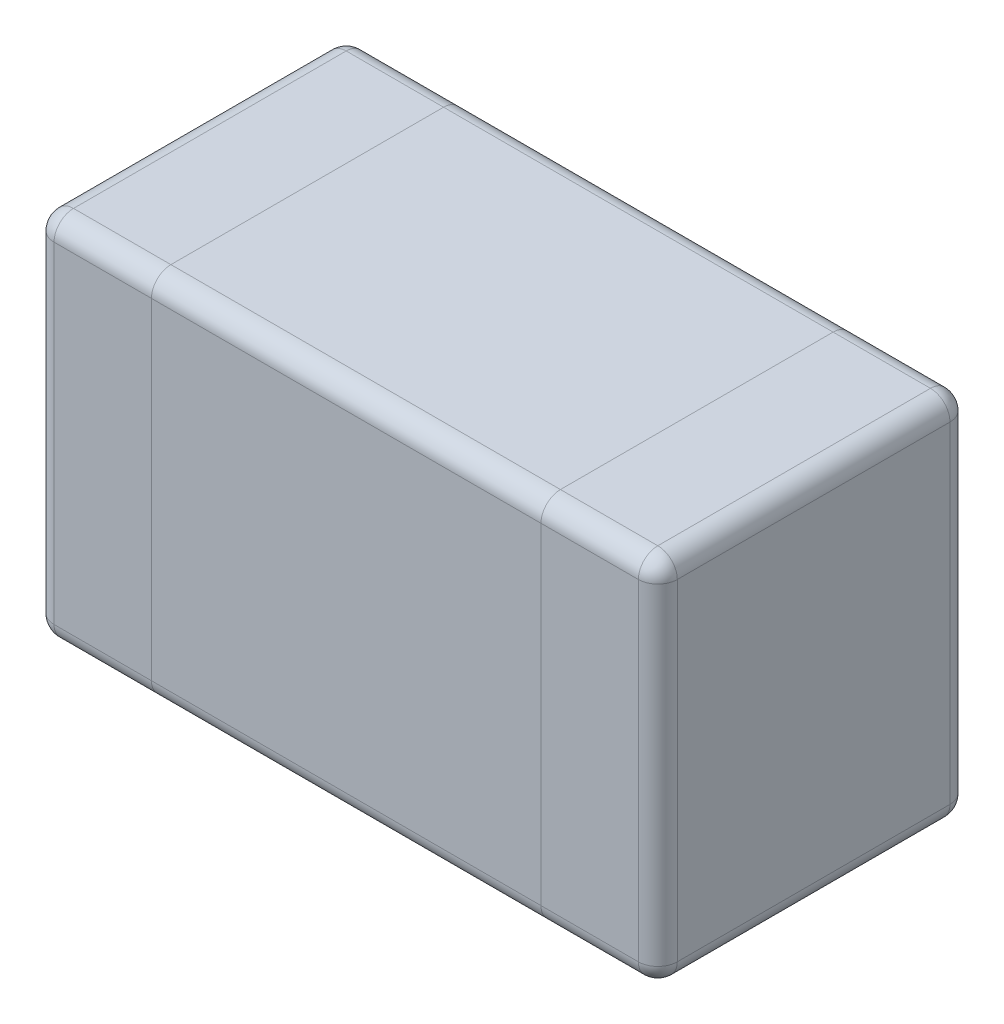
ISO-10303-21;
HEADER;
FILE_DESCRIPTION(('STEP AP214'),'2;1');
FILE_NAME('part.step','',(''),(''),'','','');
FILE_SCHEMA(('AUTOMOTIVE_DESIGN { 1 0 10303 214 1 1 1 1 }'));
ENDSEC;
DATA;
#1=APPLICATION_CONTEXT('core data for automotive mechanical design processes');
#2=APPLICATION_PROTOCOL_DEFINITION('international standard','automotive_design',2000,#1);
#3=PRODUCT_CONTEXT('',#1,'mechanical');
#4=PRODUCT('Part','Part','',(#3));
#5=PRODUCT_RELATED_PRODUCT_CATEGORY('part','',(#4));
#6=PRODUCT_DEFINITION_FORMATION('','',#4);
#7=PRODUCT_DEFINITION_CONTEXT('part definition',#1,'design');
#8=PRODUCT_DEFINITION('design','',#6,#7);
#9=PRODUCT_DEFINITION_SHAPE('','',#8);
#10=(LENGTH_UNIT() NAMED_UNIT(*) SI_UNIT(.MILLI.,.METRE.));
#11=(NAMED_UNIT(*) PLANE_ANGLE_UNIT() SI_UNIT($,.RADIAN.));
#12=(NAMED_UNIT(*) SI_UNIT($,.STERADIAN.) SOLID_ANGLE_UNIT());
#13=UNCERTAINTY_MEASURE_WITH_UNIT(LENGTH_MEASURE(1.E-05),#10,'distance_accuracy_value','');
#14=(GEOMETRIC_REPRESENTATION_CONTEXT(3) GLOBAL_UNCERTAINTY_ASSIGNED_CONTEXT((#13)) GLOBAL_UNIT_ASSIGNED_CONTEXT((#10,
#11,#12)) REPRESENTATION_CONTEXT('',''));
#15=CARTESIAN_POINT('',(0.,0.,0.));
#16=DIRECTION('',(0.,0.,1.));
#17=DIRECTION('',(1.,0.,0.));
#18=AXIS2_PLACEMENT_3D('',#15,#16,#17);
#19=CARTESIAN_POINT('',(0.799999999999999,0.95,-0.4));
#20=DIRECTION('',(0.,-1.,0.));
#21=DIRECTION('',(0.,0.,-1.));
#22=AXIS2_PLACEMENT_3D('',#19,#20,#21);
#23=PLANE('',#22);
#24=DIRECTION('',(0.,0.,1.));
#25=VECTOR('',#24,1.);
#26=CARTESIAN_POINT('',(-0.5,0.95,-0.4));
#27=LINE('',#26,#25);
#28=CARTESIAN_POINT('',(-0.5,0.95,-0.35));
#29=VERTEX_POINT('',#28);
#30=CARTESIAN_POINT('',(-0.5,0.95,0.35));
#31=VERTEX_POINT('',#30);
#32=EDGE_CURVE('E11',#29,#31,#27,.T.);
#33=ORIENTED_EDGE('',*,*,#32,.F.);
#34=DIRECTION('',(-1.,0.,0.));
#35=VECTOR('',#34,1.);
#36=CARTESIAN_POINT('',(0.799999999999999,0.95,-0.35));
#37=LINE('',#36,#35);
#38=CARTESIAN_POINT('',(-0.75,0.95,-0.35));
#39=VERTEX_POINT('',#38);
#40=EDGE_CURVE('E255',#29,#39,#37,.T.);
#41=ORIENTED_EDGE('',*,*,#40,.T.);
#42=DIRECTION('',(0.,0.,1.));
#43=VECTOR('',#42,1.);
#44=CARTESIAN_POINT('',(-0.75,0.95,-0.4));
#45=LINE('',#44,#43);
#46=CARTESIAN_POINT('',(-0.75,0.95,0.35));
#47=VERTEX_POINT('',#46);
#48=EDGE_CURVE('E258',#39,#47,#45,.T.);
#49=ORIENTED_EDGE('',*,*,#48,.T.);
#50=DIRECTION('',(1.,0.,0.));
#51=VECTOR('',#50,1.);
#52=CARTESIAN_POINT('',(0.799999999999999,0.95,0.35));
#53=LINE('',#52,#51);
#54=EDGE_CURVE('E262',#47,#31,#53,.T.);
#55=ORIENTED_EDGE('',*,*,#54,.T.);
#56=EDGE_LOOP('',(#33,#41,#49,#55));
#57=FACE_BOUND('',#56,.T.);
#58=ADVANCED_FACE('F39',(#57),#23,.F.);
#59=DIRECTION('',(0.,0.,-1.));
#60=VECTOR('',#59,1.);
#61=CARTESIAN_POINT('',(0.5,0.95,-0.4));
#62=LINE('',#61,#60);
#63=CARTESIAN_POINT('',(0.5,0.95,0.35));
#64=VERTEX_POINT('',#63);
#65=CARTESIAN_POINT('',(0.5,0.95,-0.35));
#66=VERTEX_POINT('',#65);
#67=EDGE_CURVE('E49',#64,#66,#62,.T.);
#68=ORIENTED_EDGE('',*,*,#67,.F.);
#69=CARTESIAN_POINT('',(0.75,0.95,0.35));
#70=VERTEX_POINT('',#69);
#71=EDGE_CURVE('E261',#64,#70,#53,.T.);
#72=ORIENTED_EDGE('',*,*,#71,.T.);
#73=DIRECTION('',(0.,0.,-1.));
#74=VECTOR('',#73,1.);
#75=CARTESIAN_POINT('',(0.75,0.95,-0.4));
#76=LINE('',#75,#74);
#77=CARTESIAN_POINT('',(0.75,0.95,-0.35));
#78=VERTEX_POINT('',#77);
#79=EDGE_CURVE('E252',#70,#78,#76,.T.);
#80=ORIENTED_EDGE('',*,*,#79,.T.);
#81=EDGE_CURVE('E256',#78,#66,#37,.T.);
#82=ORIENTED_EDGE('',*,*,#81,.T.);
#83=EDGE_LOOP('',(#68,#72,#80,#82));
#84=FACE_BOUND('',#83,.T.);
#85=ADVANCED_FACE('F528',(#84),#23,.F.);
#86=CARTESIAN_POINT('',(0.799999999999999,0.9,0.35));
#87=DIRECTION('',(1.,0.,0.));
#88=DIRECTION('',(0.,0.,-1.));
#89=AXIS2_PLACEMENT_3D('',#86,#87,#88);
#90=CYLINDRICAL_SURFACE('',#89,0.05);
#91=DIRECTION('',(1.,0.,0.));
#92=VECTOR('',#91,1.);
#93=CARTESIAN_POINT('',(-0.8,0.9,0.4));
#94=LINE('',#93,#92);
#95=CARTESIAN_POINT('',(-0.5,0.9,0.4));
#96=VERTEX_POINT('',#95);
#97=CARTESIAN_POINT('',(-0.75,0.9,0.4));
#98=VERTEX_POINT('',#97);
#99=EDGE_CURVE('E248',#96,#98,#94,.F.);
#100=ORIENTED_EDGE('',*,*,#99,.F.);
#101=CARTESIAN_POINT('',(-0.5,0.9,0.35));
#102=DIRECTION('',(1.,0.,0.));
#103=DIRECTION('',(0.,0.,-1.));
#104=AXIS2_PLACEMENT_3D('',#101,#102,#103);
#105=CIRCLE('',#104,0.05);
#106=EDGE_CURVE('E356',#96,#31,#105,.F.);
#107=ORIENTED_EDGE('',*,*,#106,.T.);
#108=ORIENTED_EDGE('',*,*,#54,.F.);
#109=CARTESIAN_POINT('',(-0.75,0.9,0.35));
#110=DIRECTION('',(-1.,0.,0.));
#111=DIRECTION('',(0.,-1.,0.));
#112=AXIS2_PLACEMENT_3D('',#109,#110,#111);
#113=CIRCLE('',#112,0.05);
#114=EDGE_CURVE('E332',#47,#98,#113,.F.);
#115=ORIENTED_EDGE('',*,*,#114,.T.);
#116=EDGE_LOOP('',(#100,#107,#108,#115));
#117=FACE_BOUND('',#116,.T.);
#118=ADVANCED_FACE('F485',(#117),#90,.T.);
#119=ORIENTED_EDGE('',*,*,#71,.F.);
#120=CARTESIAN_POINT('',(0.5,0.9,0.35));
#121=DIRECTION('',(-1.,0.,0.));
#122=DIRECTION('',(0.,0.,1.));
#123=AXIS2_PLACEMENT_3D('',#120,#121,#122);
#124=CIRCLE('',#123,0.05);
#125=CARTESIAN_POINT('',(0.5,0.9,0.4));
#126=VERTEX_POINT('',#125);
#127=EDGE_CURVE('E355',#64,#126,#124,.F.);
#128=ORIENTED_EDGE('',*,*,#127,.T.);
#129=CARTESIAN_POINT('',(0.75,0.9,0.4));
#130=VERTEX_POINT('',#129);
#131=EDGE_CURVE('E249',#130,#126,#94,.F.);
#132=ORIENTED_EDGE('',*,*,#131,.F.);
#133=CARTESIAN_POINT('',(0.75,0.9,0.35));
#134=DIRECTION('',(1.,0.,0.));
#135=DIRECTION('',(0.,0.,-1.));
#136=AXIS2_PLACEMENT_3D('',#133,#134,#135);
#137=CIRCLE('',#136,0.05);
#138=EDGE_CURVE('E317',#70,#130,#137,.T.);
#139=ORIENTED_EDGE('',*,*,#138,.F.);
#140=EDGE_LOOP('',(#119,#128,#132,#139));
#141=FACE_BOUND('',#140,.T.);
#142=ADVANCED_FACE('F459',(#141),#90,.T.);
#143=CARTESIAN_POINT('',(-0.8,0.95,0.4));
#144=DIRECTION('',(0.,0.,-1.));
#145=DIRECTION('',(-1.,0.,0.));
#146=AXIS2_PLACEMENT_3D('',#143,#144,#145);
#147=PLANE('',#146);
#148=DIRECTION('',(0.,-1.,0.));
#149=VECTOR('',#148,1.);
#150=CARTESIAN_POINT('',(-0.5,0.95,0.4));
#151=LINE('',#150,#149);
#152=CARTESIAN_POINT('',(-0.5,0.05,0.4));
#153=VERTEX_POINT('',#152);
#154=EDGE_CURVE('E351',#96,#153,#151,.T.);
#155=ORIENTED_EDGE('',*,*,#154,.F.);
#156=ORIENTED_EDGE('',*,*,#99,.T.);
#157=DIRECTION('',(0.,-1.,0.));
#158=VECTOR('',#157,1.);
#159=CARTESIAN_POINT('',(-0.75,0.95,0.4));
#160=LINE('',#159,#158);
#161=CARTESIAN_POINT('',(-0.75,0.05,0.4));
#162=VERTEX_POINT('',#161);
#163=EDGE_CURVE('E245',#98,#162,#160,.T.);
#164=ORIENTED_EDGE('',*,*,#163,.T.);
#165=DIRECTION('',(1.,0.,0.));
#166=VECTOR('',#165,1.);
#167=CARTESIAN_POINT('',(0.8,0.05,0.4));
#168=LINE('',#167,#166);
#169=EDGE_CURVE('E239',#162,#153,#168,.T.);
#170=ORIENTED_EDGE('',*,*,#169,.T.);
#171=EDGE_LOOP('',(#155,#156,#164,#170));
#172=FACE_BOUND('',#171,.T.);
#173=ADVANCED_FACE('F473',(#172),#147,.F.);
#174=DIRECTION('',(0.,1.,0.));
#175=VECTOR('',#174,1.);
#176=CARTESIAN_POINT('',(0.5,0.95,0.4));
#177=LINE('',#176,#175);
#178=CARTESIAN_POINT('',(0.5,0.05,0.4));
#179=VERTEX_POINT('',#178);
#180=EDGE_CURVE('E347',#179,#126,#177,.T.);
#181=ORIENTED_EDGE('',*,*,#180,.F.);
#182=CARTESIAN_POINT('',(0.75,0.05,0.4));
#183=VERTEX_POINT('',#182);
#184=EDGE_CURVE('E238',#179,#183,#168,.T.);
#185=ORIENTED_EDGE('',*,*,#184,.T.);
#186=DIRECTION('',(0.,-1.,0.));
#187=VECTOR('',#186,1.);
#188=CARTESIAN_POINT('',(0.75,0.95,0.4));
#189=LINE('',#188,#187);
#190=EDGE_CURVE('E242',#183,#130,#189,.F.);
#191=ORIENTED_EDGE('',*,*,#190,.T.);
#192=ORIENTED_EDGE('',*,*,#131,.T.);
#193=EDGE_LOOP('',(#181,#185,#191,#192));
#194=FACE_BOUND('',#193,.T.);
#195=ADVANCED_FACE('F455',(#194),#147,.F.);
#196=CARTESIAN_POINT('',(-0.8,0.05,0.35));
#197=DIRECTION('',(-1.,0.,0.));
#198=DIRECTION('',(0.,0.,1.));
#199=AXIS2_PLACEMENT_3D('',#196,#197,#198);
#200=CYLINDRICAL_SURFACE('',#199,0.05);
#201=DIRECTION('',(1.,0.,0.));
#202=VECTOR('',#201,1.);
#203=CARTESIAN_POINT('',(-0.8,0.,0.35));
#204=LINE('',#203,#202);
#205=CARTESIAN_POINT('',(-0.5,0.,0.35));
#206=VERTEX_POINT('',#205);
#207=CARTESIAN_POINT('',(-0.75,0.,0.35));
#208=VERTEX_POINT('',#207);
#209=EDGE_CURVE('E268',#206,#208,#204,.F.);
#210=ORIENTED_EDGE('',*,*,#209,.F.);
#211=CARTESIAN_POINT('',(-0.5,0.05,0.35));
#212=DIRECTION('',(1.,0.,0.));
#213=DIRECTION('',(0.,0.,-1.));
#214=AXIS2_PLACEMENT_3D('',#211,#212,#213);
#215=CIRCLE('',#214,0.05);
#216=EDGE_CURVE('E352',#206,#153,#215,.F.);
#217=ORIENTED_EDGE('',*,*,#216,.T.);
#218=ORIENTED_EDGE('',*,*,#169,.F.);
#219=CARTESIAN_POINT('',(-0.75,0.05,0.35));
#220=DIRECTION('',(-1.,0.,0.));
#221=DIRECTION('',(0.,0.,1.));
#222=AXIS2_PLACEMENT_3D('',#219,#220,#221);
#223=CIRCLE('',#222,0.05);
#224=EDGE_CURVE('E323',#162,#208,#223,.F.);
#225=ORIENTED_EDGE('',*,*,#224,.T.);
#226=EDGE_LOOP('',(#210,#217,#218,#225));
#227=FACE_BOUND('',#226,.T.);
#228=ADVANCED_FACE('F511',(#227),#200,.T.);
#229=ORIENTED_EDGE('',*,*,#184,.F.);
#230=CARTESIAN_POINT('',(0.5,0.05,0.35));
#231=DIRECTION('',(-1.,0.,0.));
#232=DIRECTION('',(0.,0.,1.));
#233=AXIS2_PLACEMENT_3D('',#230,#231,#232);
#234=CIRCLE('',#233,0.05);
#235=CARTESIAN_POINT('',(0.5,0.,0.35));
#236=VERTEX_POINT('',#235);
#237=EDGE_CURVE('E367',#179,#236,#234,.F.);
#238=ORIENTED_EDGE('',*,*,#237,.T.);
#239=CARTESIAN_POINT('',(0.75,0.,0.35));
#240=VERTEX_POINT('',#239);
#241=EDGE_CURVE('E269',#240,#236,#204,.F.);
#242=ORIENTED_EDGE('',*,*,#241,.F.);
#243=CARTESIAN_POINT('',(0.75,0.05,0.35));
#244=DIRECTION('',(1.,0.,0.));
#245=DIRECTION('',(0.,0.,-1.));
#246=AXIS2_PLACEMENT_3D('',#243,#244,#245);
#247=CIRCLE('',#246,0.05);
#248=EDGE_CURVE('E303',#183,#240,#247,.T.);
#249=ORIENTED_EDGE('',*,*,#248,.F.);
#250=EDGE_LOOP('',(#229,#238,#242,#249));
#251=FACE_BOUND('',#250,.T.);
#252=ADVANCED_FACE('F445',(#251),#200,.T.);
#253=CARTESIAN_POINT('',(0.799999999999999,0.,-0.4));
#254=DIRECTION('',(0.,-1.,0.));
#255=DIRECTION('',(0.,0.,-1.));
#256=AXIS2_PLACEMENT_3D('',#253,#254,#255);
#257=PLANE('',#256);
#258=DIRECTION('',(-1.,0.,0.));
#259=VECTOR('',#258,1.);
#260=CARTESIAN_POINT('',(0.8,0.,-0.35));
#261=LINE('',#260,#259);
#262=CARTESIAN_POINT('',(-0.75,0.,-0.35));
#263=VERTEX_POINT('',#262);
#264=CARTESIAN_POINT('',(-0.5,0.,-0.35));
#265=VERTEX_POINT('',#264);
#266=EDGE_CURVE('E276',#263,#265,#261,.F.);
#267=ORIENTED_EDGE('',*,*,#266,.T.);
#268=DIRECTION('',(0.,0.,1.));
#269=VECTOR('',#268,1.);
#270=CARTESIAN_POINT('',(-0.5,0.,-0.4));
#271=LINE('',#270,#269);
#272=EDGE_CURVE('E368',#265,#206,#271,.T.);
#273=ORIENTED_EDGE('',*,*,#272,.T.);
#274=ORIENTED_EDGE('',*,*,#209,.T.);
#275=DIRECTION('',(0.,0.,1.));
#276=VECTOR('',#275,1.);
#277=CARTESIAN_POINT('',(-0.75,0.,-0.4));
#278=LINE('',#277,#276);
#279=EDGE_CURVE('E272',#208,#263,#278,.F.);
#280=ORIENTED_EDGE('',*,*,#279,.T.);
#281=EDGE_LOOP('',(#267,#273,#274,#280));
#282=FACE_BOUND('',#281,.T.);
#283=ADVANCED_FACE('F514',(#282),#257,.T.);
#284=ORIENTED_EDGE('',*,*,#241,.T.);
#285=DIRECTION('',(0.,0.,-1.));
#286=VECTOR('',#285,1.);
#287=CARTESIAN_POINT('',(0.5,0.,-0.4));
#288=LINE('',#287,#286);
#289=CARTESIAN_POINT('',(0.5,0.,-0.35));
#290=VERTEX_POINT('',#289);
#291=EDGE_CURVE('E362',#236,#290,#288,.T.);
#292=ORIENTED_EDGE('',*,*,#291,.T.);
#293=CARTESIAN_POINT('',(0.75,0.,-0.35));
#294=VERTEX_POINT('',#293);
#295=EDGE_CURVE('E275',#290,#294,#261,.F.);
#296=ORIENTED_EDGE('',*,*,#295,.T.);
#297=DIRECTION('',(0.,0.,-1.));
#298=VECTOR('',#297,1.);
#299=CARTESIAN_POINT('',(0.75,0.,0.4));
#300=LINE('',#299,#298);
#301=EDGE_CURVE('E265',#294,#240,#300,.F.);
#302=ORIENTED_EDGE('',*,*,#301,.T.);
#303=EDGE_LOOP('',(#284,#292,#296,#302));
#304=FACE_BOUND('',#303,.T.);
#305=ADVANCED_FACE('F389',(#304),#257,.T.);
#306=CARTESIAN_POINT('',(0.799999999999999,0.9,-0.35));
#307=DIRECTION('',(-1.,0.,0.));
#308=DIRECTION('',(0.,0.,1.));
#309=AXIS2_PLACEMENT_3D('',#306,#307,#308);
#310=CYLINDRICAL_SURFACE('',#309,0.05);
#311=ORIENTED_EDGE('',*,*,#40,.F.);
#312=CARTESIAN_POINT('',(-0.5,0.9,-0.35));
#313=DIRECTION('',(1.,0.,0.));
#314=DIRECTION('',(0.,0.,-1.));
#315=AXIS2_PLACEMENT_3D('',#312,#313,#314);
#316=CIRCLE('',#315,0.05);
#317=CARTESIAN_POINT('',(-0.5,0.9,-0.4));
#318=VERTEX_POINT('',#317);
#319=EDGE_CURVE('E359',#29,#318,#316,.F.);
#320=ORIENTED_EDGE('',*,*,#319,.T.);
#321=DIRECTION('',(-1.,0.,0.));
#322=VECTOR('',#321,1.);
#323=CARTESIAN_POINT('',(-0.8,0.9,-0.4));
#324=LINE('',#323,#322);
#325=CARTESIAN_POINT('',(-0.75,0.9,-0.4));
#326=VERTEX_POINT('',#325);
#327=EDGE_CURVE('E218',#326,#318,#324,.F.);
#328=ORIENTED_EDGE('',*,*,#327,.F.);
#329=CARTESIAN_POINT('',(-0.75,0.9,-0.35));
#330=DIRECTION('',(-1.,0.,0.));
#331=DIRECTION('',(0.,0.,1.));
#332=AXIS2_PLACEMENT_3D('',#329,#330,#331);
#333=CIRCLE('',#332,0.05);
#334=EDGE_CURVE('E294',#326,#39,#333,.F.);
#335=ORIENTED_EDGE('',*,*,#334,.T.);
#336=EDGE_LOOP('',(#311,#320,#328,#335));
#337=FACE_BOUND('',#336,.T.);
#338=ADVANCED_FACE('F521',(#337),#310,.T.);
#339=CARTESIAN_POINT('',(0.5,0.9,-0.4));
#340=VERTEX_POINT('',#339);
#341=CARTESIAN_POINT('',(0.75,0.9,-0.4));
#342=VERTEX_POINT('',#341);
#343=EDGE_CURVE('E213',#340,#342,#324,.F.);
#344=ORIENTED_EDGE('',*,*,#343,.F.);
#345=CARTESIAN_POINT('',(0.5,0.9,-0.35));
#346=DIRECTION('',(-1.,0.,0.));
#347=DIRECTION('',(0.,0.,1.));
#348=AXIS2_PLACEMENT_3D('',#345,#346,#347);
#349=CIRCLE('',#348,0.05);
#350=EDGE_CURVE('E363',#340,#66,#349,.F.);
#351=ORIENTED_EDGE('',*,*,#350,.T.);
#352=ORIENTED_EDGE('',*,*,#81,.F.);
#353=CARTESIAN_POINT('',(0.75,0.9,-0.35));
#354=DIRECTION('',(1.,0.,0.));
#355=DIRECTION('',(0.,0.,-1.));
#356=AXIS2_PLACEMENT_3D('',#353,#354,#355);
#357=CIRCLE('',#356,0.05);
#358=EDGE_CURVE('E198',#342,#78,#357,.T.);
#359=ORIENTED_EDGE('',*,*,#358,.F.);
#360=EDGE_LOOP('',(#344,#351,#352,#359));
#361=FACE_BOUND('',#360,.T.);
#362=ADVANCED_FACE('F424',(#361),#310,.T.);
#363=CARTESIAN_POINT('',(-0.8,0.05,-0.35));
#364=DIRECTION('',(1.,0.,0.));
#365=DIRECTION('',(0.,0.,-1.));
#366=AXIS2_PLACEMENT_3D('',#363,#364,#365);
#367=CYLINDRICAL_SURFACE('',#366,0.05);
#368=DIRECTION('',(-1.,0.,0.));
#369=VECTOR('',#368,1.);
#370=CARTESIAN_POINT('',(-0.8,0.05,-0.4));
#371=LINE('',#370,#369);
#372=CARTESIAN_POINT('',(-0.5,0.05,-0.4));
#373=VERTEX_POINT('',#372);
#374=CARTESIAN_POINT('',(-0.75,0.05,-0.4));
#375=VERTEX_POINT('',#374);
#376=EDGE_CURVE('E210',#373,#375,#371,.T.);
#377=ORIENTED_EDGE('',*,*,#376,.F.);
#378=CARTESIAN_POINT('',(-0.5,0.05,-0.35));
#379=DIRECTION('',(1.,0.,0.));
#380=DIRECTION('',(0.,0.,-1.));
#381=AXIS2_PLACEMENT_3D('',#378,#379,#380);
#382=CIRCLE('',#381,0.05);
#383=EDGE_CURVE('E372',#373,#265,#382,.F.);
#384=ORIENTED_EDGE('',*,*,#383,.T.);
#385=ORIENTED_EDGE('',*,*,#266,.F.);
#386=CARTESIAN_POINT('',(-0.75,0.05,-0.35));
#387=DIRECTION('',(-1.,0.,0.));
#388=DIRECTION('',(0.,0.,1.));
#389=AXIS2_PLACEMENT_3D('',#386,#387,#388);
#390=CIRCLE('',#389,0.05);
#391=EDGE_CURVE('E291',#263,#375,#390,.F.);
#392=ORIENTED_EDGE('',*,*,#391,.T.);
#393=EDGE_LOOP('',(#377,#384,#385,#392));
#394=FACE_BOUND('',#393,.T.);
#395=ADVANCED_FACE('F407',(#394),#367,.T.);
#396=ORIENTED_EDGE('',*,*,#295,.F.);
#397=CARTESIAN_POINT('',(0.5,0.05,-0.35));
#398=DIRECTION('',(-1.,0.,0.));
#399=DIRECTION('',(0.,0.,1.));
#400=AXIS2_PLACEMENT_3D('',#397,#398,#399);
#401=CIRCLE('',#400,0.05);
#402=CARTESIAN_POINT('',(0.5,0.05,-0.4));
#403=VERTEX_POINT('',#402);
#404=EDGE_CURVE('E43',#290,#403,#401,.F.);
#405=ORIENTED_EDGE('',*,*,#404,.T.);
#406=CARTESIAN_POINT('',(0.75,0.05,-0.4));
#407=VERTEX_POINT('',#406);
#408=EDGE_CURVE('E201',#407,#403,#371,.T.);
#409=ORIENTED_EDGE('',*,*,#408,.F.);
#410=CARTESIAN_POINT('',(0.75,0.05,-0.35));
#411=DIRECTION('',(1.,0.,0.));
#412=DIRECTION('',(0.,0.,-1.));
#413=AXIS2_PLACEMENT_3D('',#410,#411,#412);
#414=CIRCLE('',#413,0.05);
#415=EDGE_CURVE('E190',#294,#407,#414,.T.);
#416=ORIENTED_EDGE('',*,*,#415,.F.);
#417=EDGE_LOOP('',(#396,#405,#409,#416));
#418=FACE_BOUND('',#417,.T.);
#419=ADVANCED_FACE('F202',(#418),#367,.T.);
#420=CARTESIAN_POINT('',(-0.8,0.95,-0.4));
#421=DIRECTION('',(0.,0.,1.));
#422=DIRECTION('',(1.,0.,0.));
#423=AXIS2_PLACEMENT_3D('',#420,#421,#422);
#424=PLANE('',#423);
#425=DIRECTION('',(0.,1.,0.));
#426=VECTOR('',#425,1.);
#427=CARTESIAN_POINT('',(-0.5,0.95,-0.4));
#428=LINE('',#427,#426);
#429=EDGE_CURVE('E343',#373,#318,#428,.T.);
#430=ORIENTED_EDGE('',*,*,#429,.F.);
#431=ORIENTED_EDGE('',*,*,#376,.T.);
#432=DIRECTION('',(0.,-1.,0.));
#433=VECTOR('',#432,1.);
#434=CARTESIAN_POINT('',(-0.75,0.95,-0.4));
#435=LINE('',#434,#433);
#436=EDGE_CURVE('E207',#375,#326,#435,.F.);
#437=ORIENTED_EDGE('',*,*,#436,.T.);
#438=ORIENTED_EDGE('',*,*,#327,.T.);
#439=EDGE_LOOP('',(#430,#431,#437,#438));
#440=FACE_BOUND('',#439,.T.);
#441=ADVANCED_FACE('F410',(#440),#424,.F.);
#442=DIRECTION('',(0.,-1.,0.));
#443=VECTOR('',#442,1.);
#444=CARTESIAN_POINT('',(0.5,0.95,-0.4));
#445=LINE('',#444,#443);
#446=EDGE_CURVE('E278',#340,#403,#445,.T.);
#447=ORIENTED_EDGE('',*,*,#446,.F.);
#448=ORIENTED_EDGE('',*,*,#343,.T.);
#449=DIRECTION('',(0.,-1.,0.));
#450=VECTOR('',#449,1.);
#451=CARTESIAN_POINT('',(0.75,0.95,-0.4));
#452=LINE('',#451,#450);
#453=EDGE_CURVE('E182',#342,#407,#452,.T.);
#454=ORIENTED_EDGE('',*,*,#453,.T.);
#455=ORIENTED_EDGE('',*,*,#408,.T.);
#456=EDGE_LOOP('',(#447,#448,#454,#455));
#457=FACE_BOUND('',#456,.T.);
#458=ADVANCED_FACE('F211',(#457),#424,.F.);
#459=CARTESIAN_POINT('',(0.8,0.95,0.4));
#460=DIRECTION('',(-1.,0.,0.));
#461=DIRECTION('',(0.,0.,1.));
#462=AXIS2_PLACEMENT_3D('',#459,#460,#461);
#463=PLANE('',#462);
#464=DIRECTION('',(0.,-1.,0.));
#465=VECTOR('',#464,1.);
#466=CARTESIAN_POINT('',(0.8,0.95,-0.35));
#467=LINE('',#466,#465);
#468=CARTESIAN_POINT('',(0.8,0.05,-0.35));
#469=VERTEX_POINT('',#468);
#470=CARTESIAN_POINT('',(0.8,0.9,-0.35));
#471=VERTEX_POINT('',#470);
#472=EDGE_CURVE('E184',#469,#471,#467,.F.);
#473=ORIENTED_EDGE('',*,*,#472,.T.);
#474=DIRECTION('',(0.,0.,-1.));
#475=VECTOR('',#474,1.);
#476=CARTESIAN_POINT('',(0.8,0.9,0.4));
#477=LINE('',#476,#475);
#478=CARTESIAN_POINT('',(0.8,0.9,0.35));
#479=VERTEX_POINT('',#478);
#480=EDGE_CURVE('E227',#471,#479,#477,.F.);
#481=ORIENTED_EDGE('',*,*,#480,.T.);
#482=DIRECTION('',(0.,-1.,0.));
#483=VECTOR('',#482,1.);
#484=CARTESIAN_POINT('',(0.8,0.95,0.35));
#485=LINE('',#484,#483);
#486=CARTESIAN_POINT('',(0.8,0.05,0.35));
#487=VERTEX_POINT('',#486);
#488=EDGE_CURVE('E224',#479,#487,#485,.T.);
#489=ORIENTED_EDGE('',*,*,#488,.T.);
#490=DIRECTION('',(0.,0.,-1.));
#491=VECTOR('',#490,1.);
#492=CARTESIAN_POINT('',(0.8,0.05,-0.4));
#493=LINE('',#492,#491);
#494=EDGE_CURVE('E222',#487,#469,#493,.T.);
#495=ORIENTED_EDGE('',*,*,#494,.T.);
#496=EDGE_LOOP('',(#473,#481,#489,#495));
#497=FACE_BOUND('',#496,.T.);
#498=ADVANCED_FACE('F436',(#497),#463,.F.);
#499=EDGE_CURVE('E208',#403,#373,#371,.T.);
#500=ORIENTED_EDGE('',*,*,#499,.T.);
#501=ORIENTED_EDGE('',*,*,#429,.T.);
#502=EDGE_CURVE('E216',#318,#340,#324,.F.);
#503=ORIENTED_EDGE('',*,*,#502,.T.);
#504=ORIENTED_EDGE('',*,*,#446,.T.);
#505=EDGE_LOOP('',(#500,#501,#503,#504));
#506=FACE_BOUND('',#505,.T.);
#507=ADVANCED_FACE('F416',(#506),#424,.F.);
#508=CARTESIAN_POINT('',(-0.8,0.95,0.4));
#509=DIRECTION('',(1.,0.,0.));
#510=DIRECTION('',(0.,0.,-1.));
#511=AXIS2_PLACEMENT_3D('',#508,#509,#510);
#512=PLANE('',#511);
#513=DIRECTION('',(0.,-1.,0.));
#514=VECTOR('',#513,1.);
#515=CARTESIAN_POINT('',(-0.8,0.95,0.35));
#516=LINE('',#515,#514);
#517=CARTESIAN_POINT('',(-0.8,0.05,0.35));
#518=VERTEX_POINT('',#517);
#519=CARTESIAN_POINT('',(-0.8,0.9,0.35));
#520=VERTEX_POINT('',#519);
#521=EDGE_CURVE('E231',#518,#520,#516,.F.);
#522=ORIENTED_EDGE('',*,*,#521,.T.);
#523=DIRECTION('',(0.,0.,1.));
#524=VECTOR('',#523,1.);
#525=CARTESIAN_POINT('',(-0.8,0.9,0.4));
#526=LINE('',#525,#524);
#527=CARTESIAN_POINT('',(-0.8,0.9,-0.35));
#528=VERTEX_POINT('',#527);
#529=EDGE_CURVE('E236',#520,#528,#526,.F.);
#530=ORIENTED_EDGE('',*,*,#529,.T.);
#531=DIRECTION('',(0.,-1.,0.));
#532=VECTOR('',#531,1.);
#533=CARTESIAN_POINT('',(-0.8,0.95,-0.35));
#534=LINE('',#533,#532);
#535=CARTESIAN_POINT('',(-0.8,0.05,-0.35));
#536=VERTEX_POINT('',#535);
#537=EDGE_CURVE('E233',#528,#536,#534,.T.);
#538=ORIENTED_EDGE('',*,*,#537,.T.);
#539=DIRECTION('',(0.,0.,1.));
#540=VECTOR('',#539,1.);
#541=CARTESIAN_POINT('',(-0.8,0.05,0.4));
#542=LINE('',#541,#540);
#543=EDGE_CURVE('E229',#536,#518,#542,.T.);
#544=ORIENTED_EDGE('',*,*,#543,.T.);
#545=EDGE_LOOP('',(#522,#530,#538,#544));
#546=FACE_BOUND('',#545,.T.);
#547=ADVANCED_FACE('F493',(#546),#512,.F.);
#548=EDGE_CURVE('E253',#126,#96,#94,.F.);
#549=ORIENTED_EDGE('',*,*,#548,.T.);
#550=ORIENTED_EDGE('',*,*,#154,.T.);
#551=EDGE_CURVE('E243',#153,#179,#168,.T.);
#552=ORIENTED_EDGE('',*,*,#551,.T.);
#553=ORIENTED_EDGE('',*,*,#180,.T.);
#554=EDGE_LOOP('',(#549,#550,#552,#553));
#555=FACE_BOUND('',#554,.T.);
#556=ADVANCED_FACE('F466',(#555),#147,.F.);
#557=EDGE_CURVE('E259',#66,#29,#37,.T.);
#558=ORIENTED_EDGE('',*,*,#557,.T.);
#559=ORIENTED_EDGE('',*,*,#32,.T.);
#560=EDGE_CURVE('E266',#31,#64,#53,.T.);
#561=ORIENTED_EDGE('',*,*,#560,.T.);
#562=ORIENTED_EDGE('',*,*,#67,.T.);
#563=EDGE_LOOP('',(#558,#559,#561,#562));
#564=FACE_BOUND('',#563,.T.);
#565=ADVANCED_FACE('F526',(#564),#23,.F.);
#566=ORIENTED_EDGE('',*,*,#272,.F.);
#567=EDGE_CURVE('E279',#265,#290,#261,.F.);
#568=ORIENTED_EDGE('',*,*,#567,.T.);
#569=ORIENTED_EDGE('',*,*,#291,.F.);
#570=EDGE_CURVE('E273',#236,#206,#204,.F.);
#571=ORIENTED_EDGE('',*,*,#570,.T.);
#572=EDGE_LOOP('',(#566,#568,#569,#571));
#573=FACE_BOUND('',#572,.T.);
#574=ADVANCED_FACE('F401',(#573),#257,.T.);
#575=CARTESIAN_POINT('',(-0.75,0.95,0.35));
#576=DIRECTION('',(0.,-1.,0.));
#577=DIRECTION('',(0.,0.,-1.));
#578=AXIS2_PLACEMENT_3D('',#575,#576,#577);
#579=CYLINDRICAL_SURFACE('',#578,0.05);
#580=CARTESIAN_POINT('',(-0.75,0.9,0.35));
#581=DIRECTION('',(0.,1.,0.));
#582=DIRECTION('',(0.,0.,1.));
#583=AXIS2_PLACEMENT_3D('',#580,#581,#582);
#584=CIRCLE('',#583,0.05);
#585=EDGE_CURVE('E338',#520,#98,#584,.T.);
#586=ORIENTED_EDGE('',*,*,#585,.F.);
#587=ORIENTED_EDGE('',*,*,#521,.F.);
#588=CARTESIAN_POINT('',(-0.75,0.05,0.35));
#589=DIRECTION('',(0.,-1.,0.));
#590=DIRECTION('',(0.,0.,-1.));
#591=AXIS2_PLACEMENT_3D('',#588,#589,#590);
#592=CIRCLE('',#591,0.05);
#593=EDGE_CURVE('E335',#162,#518,#592,.T.);
#594=ORIENTED_EDGE('',*,*,#593,.F.);
#595=ORIENTED_EDGE('',*,*,#163,.F.);
#596=EDGE_LOOP('',(#586,#587,#594,#595));
#597=FACE_BOUND('',#596,.T.);
#598=ADVANCED_FACE('F41',(#597),#579,.T.);
#599=CARTESIAN_POINT('',(-0.75,0.9,0.35));
#600=DIRECTION('',(0.,0.,1.));
#601=DIRECTION('',(1.,0.,0.));
#602=AXIS2_PLACEMENT_3D('',#599,#600,#601);
#603=SPHERICAL_SURFACE('',#602,0.05);
#604=CARTESIAN_POINT('',(-0.75,0.9,0.35));
#605=DIRECTION('',(0.,0.,1.));
#606=DIRECTION('',(1.,0.,0.));
#607=AXIS2_PLACEMENT_3D('',#604,#605,#606);
#608=CIRCLE('',#607,0.05);
#609=EDGE_CURVE('E329',#520,#47,#608,.F.);
#610=ORIENTED_EDGE('',*,*,#609,.F.);
#611=ORIENTED_EDGE('',*,*,#585,.T.);
#612=ORIENTED_EDGE('',*,*,#114,.F.);
#613=EDGE_LOOP('',(#610,#611,#612));
#614=FACE_BOUND('',#613,.T.);
#615=ADVANCED_FACE('F482',(#614),#603,.T.);
#616=CARTESIAN_POINT('',(-0.75,0.05,0.35));
#617=DIRECTION('',(0.,0.,1.));
#618=DIRECTION('',(1.,0.,0.));
#619=AXIS2_PLACEMENT_3D('',#616,#617,#618);
#620=SPHERICAL_SURFACE('',#619,0.05);
#621=ORIENTED_EDGE('',*,*,#224,.F.);
#622=ORIENTED_EDGE('',*,*,#593,.T.);
#623=CARTESIAN_POINT('',(-0.75,0.05,0.35));
#624=DIRECTION('',(0.,0.,1.));
#625=DIRECTION('',(1.,0.,0.));
#626=AXIS2_PLACEMENT_3D('',#623,#624,#625);
#627=CIRCLE('',#626,0.05);
#628=EDGE_CURVE('E326',#208,#518,#627,.F.);
#629=ORIENTED_EDGE('',*,*,#628,.F.);
#630=EDGE_LOOP('',(#621,#622,#629));
#631=FACE_BOUND('',#630,.T.);
#632=ADVANCED_FACE('F509',(#631),#620,.T.);
#633=ORIENTED_EDGE('',*,*,#106,.F.);
#634=ORIENTED_EDGE('',*,*,#548,.F.);
#635=ORIENTED_EDGE('',*,*,#127,.F.);
#636=ORIENTED_EDGE('',*,*,#560,.F.);
#637=EDGE_LOOP('',(#633,#634,#635,#636));
#638=FACE_BOUND('',#637,.T.);
#639=ADVANCED_FACE('F468',(#638),#90,.T.);
#640=CARTESIAN_POINT('',(-0.75,0.9,-0.4));
#641=DIRECTION('',(0.,0.,1.));
#642=DIRECTION('',(1.,0.,0.));
#643=AXIS2_PLACEMENT_3D('',#640,#641,#642);
#644=CYLINDRICAL_SURFACE('',#643,0.05);
#645=ORIENTED_EDGE('',*,*,#609,.T.);
#646=ORIENTED_EDGE('',*,*,#48,.F.);
#647=CARTESIAN_POINT('',(-0.75,0.9,-0.35));
#648=DIRECTION('',(0.,0.,-1.));
#649=DIRECTION('',(-1.,0.,0.));
#650=AXIS2_PLACEMENT_3D('',#647,#648,#649);
#651=CIRCLE('',#650,0.05);
#652=EDGE_CURVE('E314',#528,#39,#651,.T.);
#653=ORIENTED_EDGE('',*,*,#652,.F.);
#654=ORIENTED_EDGE('',*,*,#529,.F.);
#655=EDGE_LOOP('',(#645,#646,#653,#654));
#656=FACE_BOUND('',#655,.T.);
#657=ADVANCED_FACE('F490',(#656),#644,.T.);
#658=CARTESIAN_POINT('',(-0.75,0.95,-0.35));
#659=DIRECTION('',(0.,-1.,0.));
#660=DIRECTION('',(0.,0.,-1.));
#661=AXIS2_PLACEMENT_3D('',#658,#659,#660);
#662=CYLINDRICAL_SURFACE('',#661,0.05);
#663=CARTESIAN_POINT('',(-0.75,0.05,-0.35));
#664=DIRECTION('',(0.,-1.,0.));
#665=DIRECTION('',(0.,0.,-1.));
#666=AXIS2_PLACEMENT_3D('',#663,#664,#665);
#667=CIRCLE('',#666,0.05);
#668=EDGE_CURVE('E308',#536,#375,#667,.T.);
#669=ORIENTED_EDGE('',*,*,#668,.F.);
#670=ORIENTED_EDGE('',*,*,#537,.F.);
#671=CARTESIAN_POINT('',(-0.75,0.9,-0.35));
#672=DIRECTION('',(0.,1.,0.));
#673=DIRECTION('',(0.,0.,1.));
#674=AXIS2_PLACEMENT_3D('',#671,#672,#673);
#675=CIRCLE('',#674,0.05);
#676=EDGE_CURVE('E311',#326,#528,#675,.T.);
#677=ORIENTED_EDGE('',*,*,#676,.F.);
#678=ORIENTED_EDGE('',*,*,#436,.F.);
#679=EDGE_LOOP('',(#669,#670,#677,#678));
#680=FACE_BOUND('',#679,.T.);
#681=ADVANCED_FACE('F497',(#680),#662,.T.);
#682=CARTESIAN_POINT('',(-0.75,0.05,0.4));
#683=DIRECTION('',(0.,0.,-1.));
#684=DIRECTION('',(-1.,0.,0.));
#685=AXIS2_PLACEMENT_3D('',#682,#683,#684);
#686=CYLINDRICAL_SURFACE('',#685,0.05);
#687=ORIENTED_EDGE('',*,*,#628,.T.);
#688=ORIENTED_EDGE('',*,*,#543,.F.);
#689=CARTESIAN_POINT('',(-0.75,0.05,-0.35));
#690=DIRECTION('',(0.,0.,-1.));
#691=DIRECTION('',(-1.,0.,0.));
#692=AXIS2_PLACEMENT_3D('',#689,#690,#691);
#693=CIRCLE('',#692,0.05);
#694=EDGE_CURVE('E306',#263,#536,#693,.T.);
#695=ORIENTED_EDGE('',*,*,#694,.F.);
#696=ORIENTED_EDGE('',*,*,#279,.F.);
#697=EDGE_LOOP('',(#687,#688,#695,#696));
#698=FACE_BOUND('',#697,.T.);
#699=ADVANCED_FACE('F504',(#698),#686,.T.);
#700=ORIENTED_EDGE('',*,*,#216,.F.);
#701=ORIENTED_EDGE('',*,*,#570,.F.);
#702=ORIENTED_EDGE('',*,*,#237,.F.);
#703=ORIENTED_EDGE('',*,*,#551,.F.);
#704=EDGE_LOOP('',(#700,#701,#702,#703));
#705=FACE_BOUND('',#704,.T.);
#706=ADVANCED_FACE('F513',(#705),#200,.T.);
#707=CARTESIAN_POINT('',(0.75,0.95,0.35));
#708=DIRECTION('',(0.,-1.,0.));
#709=DIRECTION('',(0.,0.,-1.));
#710=AXIS2_PLACEMENT_3D('',#707,#708,#709);
#711=CYLINDRICAL_SURFACE('',#710,0.05);
#712=CARTESIAN_POINT('',(0.75,0.9,0.35));
#713=DIRECTION('',(0.,1.,0.));
#714=DIRECTION('',(0.,0.,1.));
#715=AXIS2_PLACEMENT_3D('',#712,#713,#714);
#716=CIRCLE('',#715,0.05);
#717=EDGE_CURVE('E320',#130,#479,#716,.T.);
#718=ORIENTED_EDGE('',*,*,#717,.F.);
#719=ORIENTED_EDGE('',*,*,#190,.F.);
#720=CARTESIAN_POINT('',(0.75,0.05,0.35));
#721=DIRECTION('',(0.,-1.,0.));
#722=DIRECTION('',(0.,0.,-1.));
#723=AXIS2_PLACEMENT_3D('',#720,#721,#722);
#724=CIRCLE('',#723,0.05);
#725=EDGE_CURVE('E300',#487,#183,#724,.T.);
#726=ORIENTED_EDGE('',*,*,#725,.F.);
#727=ORIENTED_EDGE('',*,*,#488,.F.);
#728=EDGE_LOOP('',(#718,#719,#726,#727));
#729=FACE_BOUND('',#728,.T.);
#730=ADVANCED_FACE('F452',(#729),#711,.T.);
#731=CARTESIAN_POINT('',(0.75,0.9,0.35));
#732=DIRECTION('',(0.,0.,1.));
#733=DIRECTION('',(1.,0.,0.));
#734=AXIS2_PLACEMENT_3D('',#731,#732,#733);
#735=SPHERICAL_SURFACE('',#734,0.05);
#736=ORIENTED_EDGE('',*,*,#138,.T.);
#737=ORIENTED_EDGE('',*,*,#717,.T.);
#738=CARTESIAN_POINT('',(0.75,0.9,0.35));
#739=DIRECTION('',(0.,0.,1.));
#740=DIRECTION('',(1.,0.,0.));
#741=AXIS2_PLACEMENT_3D('',#738,#739,#740);
#742=CIRCLE('',#741,0.05);
#743=EDGE_CURVE('E297',#70,#479,#742,.F.);
#744=ORIENTED_EDGE('',*,*,#743,.F.);
#745=EDGE_LOOP('',(#736,#737,#744));
#746=FACE_BOUND('',#745,.T.);
#747=ADVANCED_FACE('F537',(#746),#735,.T.);
#748=CARTESIAN_POINT('',(-0.75,0.9,-0.35));
#749=DIRECTION('',(0.,0.,1.));
#750=DIRECTION('',(1.,0.,0.));
#751=AXIS2_PLACEMENT_3D('',#748,#749,#750);
#752=SPHERICAL_SURFACE('',#751,0.05);
#753=ORIENTED_EDGE('',*,*,#676,.T.);
#754=ORIENTED_EDGE('',*,*,#652,.T.);
#755=ORIENTED_EDGE('',*,*,#334,.F.);
#756=EDGE_LOOP('',(#753,#754,#755));
#757=FACE_BOUND('',#756,.T.);
#758=ADVANCED_FACE('F539',(#757),#752,.T.);
#759=CARTESIAN_POINT('',(-0.75,0.05,-0.35));
#760=DIRECTION('',(0.,0.,1.));
#761=DIRECTION('',(1.,0.,0.));
#762=AXIS2_PLACEMENT_3D('',#759,#760,#761);
#763=SPHERICAL_SURFACE('',#762,0.05);
#764=ORIENTED_EDGE('',*,*,#694,.T.);
#765=ORIENTED_EDGE('',*,*,#668,.T.);
#766=ORIENTED_EDGE('',*,*,#391,.F.);
#767=EDGE_LOOP('',(#764,#765,#766));
#768=FACE_BOUND('',#767,.T.);
#769=ADVANCED_FACE('F545',(#768),#763,.T.);
#770=CARTESIAN_POINT('',(0.75,0.05,0.35));
#771=DIRECTION('',(0.,0.,1.));
#772=DIRECTION('',(1.,0.,0.));
#773=AXIS2_PLACEMENT_3D('',#770,#771,#772);
#774=SPHERICAL_SURFACE('',#773,0.05);
#775=ORIENTED_EDGE('',*,*,#725,.T.);
#776=ORIENTED_EDGE('',*,*,#248,.T.);
#777=CARTESIAN_POINT('',(0.75,0.05,0.35));
#778=DIRECTION('',(0.,0.,1.));
#779=DIRECTION('',(1.,0.,0.));
#780=AXIS2_PLACEMENT_3D('',#777,#778,#779);
#781=CIRCLE('',#780,0.05);
#782=EDGE_CURVE('E288',#487,#240,#781,.F.);
#783=ORIENTED_EDGE('',*,*,#782,.F.);
#784=EDGE_LOOP('',(#775,#776,#783));
#785=FACE_BOUND('',#784,.T.);
#786=ADVANCED_FACE('F448',(#785),#774,.T.);
#787=CARTESIAN_POINT('',(0.75,0.9,-0.4));
#788=DIRECTION('',(0.,0.,-1.));
#789=DIRECTION('',(-1.,0.,0.));
#790=AXIS2_PLACEMENT_3D('',#787,#788,#789);
#791=CYLINDRICAL_SURFACE('',#790,0.05);
#792=ORIENTED_EDGE('',*,*,#743,.T.);
#793=ORIENTED_EDGE('',*,*,#480,.F.);
#794=CARTESIAN_POINT('',(0.75,0.9,-0.35));
#795=DIRECTION('',(0.,0.,-1.));
#796=DIRECTION('',(-1.,0.,0.));
#797=AXIS2_PLACEMENT_3D('',#794,#795,#796);
#798=CIRCLE('',#797,0.05);
#799=EDGE_CURVE('E285',#78,#471,#798,.T.);
#800=ORIENTED_EDGE('',*,*,#799,.F.);
#801=ORIENTED_EDGE('',*,*,#79,.F.);
#802=EDGE_LOOP('',(#792,#793,#800,#801));
#803=FACE_BOUND('',#802,.T.);
#804=ADVANCED_FACE('F432',(#803),#791,.T.);
#805=ORIENTED_EDGE('',*,*,#319,.F.);
#806=ORIENTED_EDGE('',*,*,#557,.F.);
#807=ORIENTED_EDGE('',*,*,#350,.F.);
#808=ORIENTED_EDGE('',*,*,#502,.F.);
#809=EDGE_LOOP('',(#805,#806,#807,#808));
#810=FACE_BOUND('',#809,.T.);
#811=ADVANCED_FACE('F419',(#810),#310,.T.);
#812=ORIENTED_EDGE('',*,*,#383,.F.);
#813=ORIENTED_EDGE('',*,*,#499,.F.);
#814=ORIENTED_EDGE('',*,*,#404,.F.);
#815=ORIENTED_EDGE('',*,*,#567,.F.);
#816=EDGE_LOOP('',(#812,#813,#814,#815));
#817=FACE_BOUND('',#816,.T.);
#818=ADVANCED_FACE('F398',(#817),#367,.T.);
#819=CARTESIAN_POINT('',(0.75,0.05,0.4));
#820=DIRECTION('',(0.,0.,1.));
#821=DIRECTION('',(1.,0.,0.));
#822=AXIS2_PLACEMENT_3D('',#819,#820,#821);
#823=CYLINDRICAL_SURFACE('',#822,0.05);
#824=ORIENTED_EDGE('',*,*,#782,.T.);
#825=ORIENTED_EDGE('',*,*,#301,.F.);
#826=CARTESIAN_POINT('',(0.75,0.05,-0.35));
#827=DIRECTION('',(0.,0.,-1.));
#828=DIRECTION('',(-1.,0.,0.));
#829=AXIS2_PLACEMENT_3D('',#826,#827,#828);
#830=CIRCLE('',#829,0.05);
#831=EDGE_CURVE('E194',#469,#294,#830,.T.);
#832=ORIENTED_EDGE('',*,*,#831,.F.);
#833=ORIENTED_EDGE('',*,*,#494,.F.);
#834=EDGE_LOOP('',(#824,#825,#832,#833));
#835=FACE_BOUND('',#834,.T.);
#836=ADVANCED_FACE('F440',(#835),#823,.T.);
#837=CARTESIAN_POINT('',(0.75,0.9,-0.35));
#838=DIRECTION('',(0.,0.,1.));
#839=DIRECTION('',(1.,0.,0.));
#840=AXIS2_PLACEMENT_3D('',#837,#838,#839);
#841=SPHERICAL_SURFACE('',#840,0.05);
#842=ORIENTED_EDGE('',*,*,#358,.T.);
#843=ORIENTED_EDGE('',*,*,#799,.T.);
#844=CARTESIAN_POINT('',(0.75,0.9,-0.35));
#845=DIRECTION('',(0.,1.,0.));
#846=DIRECTION('',(0.,0.,1.));
#847=AXIS2_PLACEMENT_3D('',#844,#845,#846);
#848=CIRCLE('',#847,0.05);
#849=EDGE_CURVE('E187',#342,#471,#848,.F.);
#850=ORIENTED_EDGE('',*,*,#849,.F.);
#851=EDGE_LOOP('',(#842,#843,#850));
#852=FACE_BOUND('',#851,.T.);
#853=ADVANCED_FACE('F428',(#852),#841,.T.);
#854=CARTESIAN_POINT('',(0.75,0.05,-0.35));
#855=DIRECTION('',(0.,0.,1.));
#856=DIRECTION('',(1.,0.,0.));
#857=AXIS2_PLACEMENT_3D('',#854,#855,#856);
#858=SPHERICAL_SURFACE('',#857,0.05);
#859=ORIENTED_EDGE('',*,*,#831,.T.);
#860=ORIENTED_EDGE('',*,*,#415,.T.);
#861=CARTESIAN_POINT('',(0.75,0.05,-0.35));
#862=DIRECTION('',(0.,-1.,0.));
#863=DIRECTION('',(0.,0.,-1.));
#864=AXIS2_PLACEMENT_3D('',#861,#862,#863);
#865=CIRCLE('',#864,0.05);
#866=EDGE_CURVE('E178',#469,#407,#865,.F.);
#867=ORIENTED_EDGE('',*,*,#866,.F.);
#868=EDGE_LOOP('',(#859,#860,#867));
#869=FACE_BOUND('',#868,.T.);
#870=ADVANCED_FACE('F192',(#869),#858,.T.);
#871=CARTESIAN_POINT('',(0.75,0.95,-0.35));
#872=DIRECTION('',(0.,-1.,0.));
#873=DIRECTION('',(0.,0.,-1.));
#874=AXIS2_PLACEMENT_3D('',#871,#872,#873);
#875=CYLINDRICAL_SURFACE('',#874,0.05);
#876=ORIENTED_EDGE('',*,*,#849,.T.);
#877=ORIENTED_EDGE('',*,*,#472,.F.);
#878=ORIENTED_EDGE('',*,*,#866,.T.);
#879=ORIENTED_EDGE('',*,*,#453,.F.);
#880=EDGE_LOOP('',(#876,#877,#878,#879));
#881=FACE_BOUND('',#880,.T.);
#882=ADVANCED_FACE('F180',(#881),#875,.T.);
#883=CLOSED_SHELL('',(#58,#85,#118,#142,#173,#195,#228,#252,#283,#305,#338,#362,#395,#419,#441,
#458,#498,#507,#547,#556,#565,#574,#598,#615,#632,#639,#657,#681,#699,#706,#730,#747,#758,#769,
#786,#804,#811,#818,#836,#853,#870,#882));
#884=MANIFOLD_SOLID_BREP('B2',#883);
#885=ADVANCED_BREP_SHAPE_REPRESENTATION('',(#18,#884),#14);
#886=SHAPE_DEFINITION_REPRESENTATION(#9,#885);
ENDSEC;
END-ISO-10303-21;
